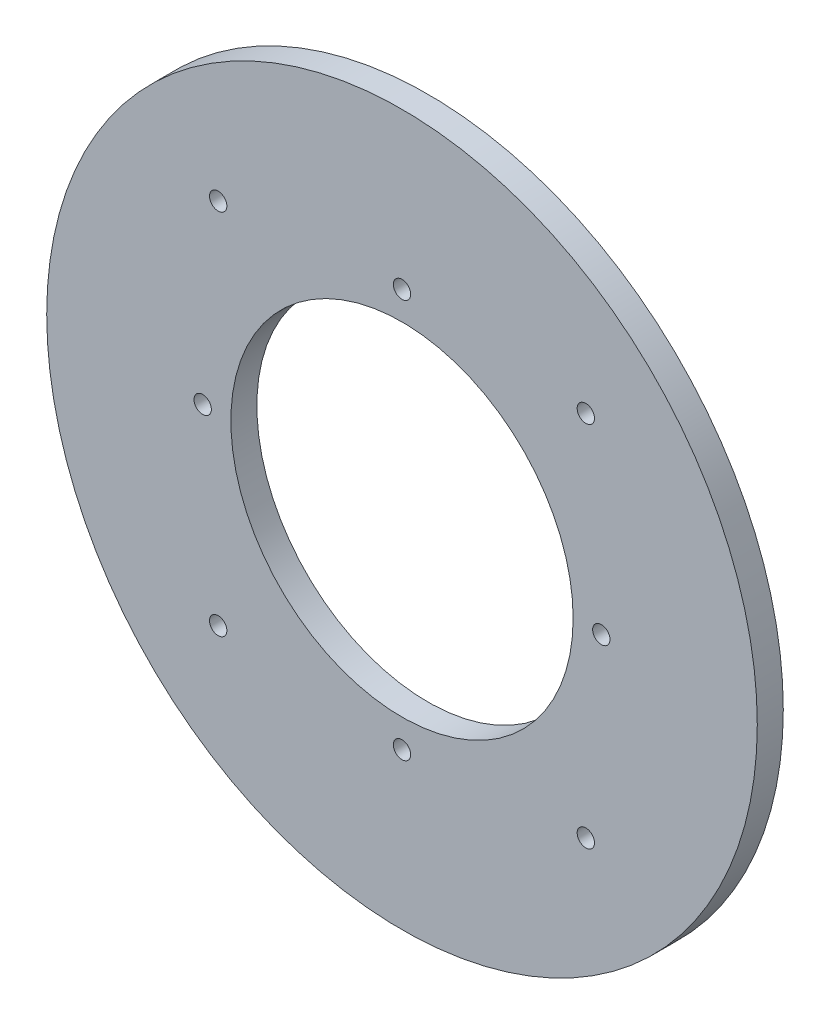
ISO-10303-21;
HEADER;
FILE_DESCRIPTION(('STEP AP214'),'2;1');
FILE_NAME('part.step','',(''),(''),'','','');
FILE_SCHEMA(('AUTOMOTIVE_DESIGN { 1 0 10303 214 1 1 1 1 }'));
ENDSEC;
DATA;
#1=APPLICATION_CONTEXT('core data for automotive mechanical design processes');
#2=APPLICATION_PROTOCOL_DEFINITION('international standard','automotive_design',2000,#1);
#3=PRODUCT_CONTEXT('',#1,'mechanical');
#4=PRODUCT('Part','Part','',(#3));
#5=PRODUCT_RELATED_PRODUCT_CATEGORY('part','',(#4));
#6=PRODUCT_DEFINITION_FORMATION('','',#4);
#7=PRODUCT_DEFINITION_CONTEXT('part definition',#1,'design');
#8=PRODUCT_DEFINITION('design','',#6,#7);
#9=PRODUCT_DEFINITION_SHAPE('','',#8);
#10=(LENGTH_UNIT() NAMED_UNIT(*) SI_UNIT(.MILLI.,.METRE.));
#11=(NAMED_UNIT(*) PLANE_ANGLE_UNIT() SI_UNIT($,.RADIAN.));
#12=(NAMED_UNIT(*) SI_UNIT($,.STERADIAN.) SOLID_ANGLE_UNIT());
#13=UNCERTAINTY_MEASURE_WITH_UNIT(LENGTH_MEASURE(1.E-05),#10,'distance_accuracy_value','');
#14=(GEOMETRIC_REPRESENTATION_CONTEXT(3) GLOBAL_UNCERTAINTY_ASSIGNED_CONTEXT((#13)) GLOBAL_UNIT_ASSIGNED_CONTEXT((#10,
#11,#12)) REPRESENTATION_CONTEXT('',''));
#15=CARTESIAN_POINT('',(0.,0.,0.));
#16=DIRECTION('',(0.,0.,1.));
#17=DIRECTION('',(1.,0.,0.));
#18=AXIS2_PLACEMENT_3D('',#15,#16,#17);
#19=CARTESIAN_POINT('',(0.,0.,6.));
#20=DIRECTION('',(0.,0.,1.));
#21=DIRECTION('',(1.,0.,0.));
#22=AXIS2_PLACEMENT_3D('',#19,#20,#21);
#23=PLANE('',#22);
#24=CARTESIAN_POINT('',(0.,46.,6.));
#25=DIRECTION('',(0.,0.,1.));
#26=DIRECTION('',(1.,0.,0.));
#27=AXIS2_PLACEMENT_3D('',#24,#25,#26);
#28=CIRCLE('',#27,2.);
#29=CARTESIAN_POINT('',(2.,46.,6.));
#30=VERTEX_POINT('',#29);
#31=EDGE_CURVE('E72',#30,#30,#28,.T.);
#32=ORIENTED_EDGE('',*,*,#31,.F.);
#33=EDGE_LOOP('',(#32));
#34=FACE_BOUND('',#33,.T.);
#35=CARTESIAN_POINT('',(46.,-1.60608141586784E-13,6.));
#36=DIRECTION('',(0.,0.,1.));
#37=DIRECTION('',(1.,0.,0.));
#38=AXIS2_PLACEMENT_3D('',#35,#36,#37);
#39=CIRCLE('',#38,2.);
#40=CARTESIAN_POINT('',(48.,-1.60608141586784E-13,6.));
#41=VERTEX_POINT('',#40);
#42=EDGE_CURVE('E124',#41,#41,#39,.T.);
#43=ORIENTED_EDGE('',*,*,#42,.F.);
#44=EDGE_LOOP('',(#43));
#45=FACE_BOUND('',#44,.T.);
#46=CARTESIAN_POINT('',(-3.21216283173568E-13,-46.,6.));
#47=DIRECTION('',(0.,0.,1.));
#48=DIRECTION('',(1.,0.,0.));
#49=AXIS2_PLACEMENT_3D('',#46,#47,#48);
#50=CIRCLE('',#49,2.);
#51=CARTESIAN_POINT('',(1.99999999999968,-46.,6.));
#52=VERTEX_POINT('',#51);
#53=EDGE_CURVE('E128',#52,#52,#50,.T.);
#54=ORIENTED_EDGE('',*,*,#53,.F.);
#55=EDGE_LOOP('',(#54));
#56=FACE_BOUND('',#55,.T.);
#57=CARTESIAN_POINT('',(-46.,4.81824424760352E-13,6.));
#58=DIRECTION('',(0.,0.,1.));
#59=DIRECTION('',(1.,0.,0.));
#60=AXIS2_PLACEMENT_3D('',#57,#58,#59);
#61=CIRCLE('',#60,2.);
#62=CARTESIAN_POINT('',(-44.,4.81824424760352E-13,6.));
#63=VERTEX_POINT('',#62);
#64=EDGE_CURVE('E132',#63,#63,#61,.T.);
#65=ORIENTED_EDGE('',*,*,#64,.F.);
#66=EDGE_LOOP('',(#65));
#67=FACE_BOUND('',#66,.T.);
#68=CARTESIAN_POINT('',(-42.426406871193,42.4264068711927,6.));
#69=DIRECTION('',(0.,0.,1.));
#70=DIRECTION('',(0.,1.,0.));
#71=AXIS2_PLACEMENT_3D('',#68,#69,#70);
#72=CIRCLE('',#71,2.);
#73=CARTESIAN_POINT('',(-42.426406871193,44.4264068711927,6.));
#74=VERTEX_POINT('',#73);
#75=EDGE_CURVE('E62',#74,#74,#72,.T.);
#76=ORIENTED_EDGE('',*,*,#75,.F.);
#77=EDGE_LOOP('',(#76));
#78=FACE_BOUND('',#77,.T.);
#79=CARTESIAN_POINT('',(-42.4264068711928,-42.4264068711928,6.));
#80=DIRECTION('',(0.,0.,1.));
#81=DIRECTION('',(-1.,0.,0.));
#82=AXIS2_PLACEMENT_3D('',#79,#80,#81);
#83=CIRCLE('',#82,2.);
#84=CARTESIAN_POINT('',(-44.4264068711928,-42.4264068711928,6.));
#85=VERTEX_POINT('',#84);
#86=EDGE_CURVE('E83',#85,#85,#83,.T.);
#87=ORIENTED_EDGE('',*,*,#86,.F.);
#88=EDGE_LOOP('',(#87));
#89=FACE_BOUND('',#88,.T.);
#90=CARTESIAN_POINT('',(42.4264068711933,-42.4264068711924,6.));
#91=DIRECTION('',(0.,0.,1.));
#92=DIRECTION('',(0.,-1.,0.));
#93=AXIS2_PLACEMENT_3D('',#90,#91,#92);
#94=CIRCLE('',#93,2.);
#95=CARTESIAN_POINT('',(42.4264068711933,-44.4264068711924,6.));
#96=VERTEX_POINT('',#95);
#97=EDGE_CURVE('E79',#96,#96,#94,.T.);
#98=ORIENTED_EDGE('',*,*,#97,.F.);
#99=EDGE_LOOP('',(#98));
#100=FACE_BOUND('',#99,.T.);
#101=CARTESIAN_POINT('',(42.4264068711928,42.4264068711928,6.));
#102=DIRECTION('',(0.,0.,1.));
#103=DIRECTION('',(1.,0.,0.));
#104=AXIS2_PLACEMENT_3D('',#101,#102,#103);
#105=CIRCLE('',#104,2.);
#106=CARTESIAN_POINT('',(44.4264068711928,42.4264068711928,6.));
#107=VERTEX_POINT('',#106);
#108=EDGE_CURVE('E57',#107,#107,#105,.T.);
#109=ORIENTED_EDGE('',*,*,#108,.F.);
#110=EDGE_LOOP('',(#109));
#111=FACE_BOUND('',#110,.T.);
#112=CARTESIAN_POINT('',(0.,0.,6.));
#113=DIRECTION('',(0.,0.,1.));
#114=DIRECTION('',(1.,0.,0.));
#115=AXIS2_PLACEMENT_3D('',#112,#113,#114);
#116=CIRCLE('',#115,82.);
#117=CARTESIAN_POINT('',(82.,0.,6.));
#118=VERTEX_POINT('',#117);
#119=EDGE_CURVE('E10',#118,#118,#116,.T.);
#120=ORIENTED_EDGE('',*,*,#119,.T.);
#121=EDGE_LOOP('',(#120));
#122=FACE_BOUND('',#121,.T.);
#123=CARTESIAN_POINT('',(0.,0.,6.));
#124=DIRECTION('',(0.,0.,1.));
#125=DIRECTION('',(1.,0.,0.));
#126=AXIS2_PLACEMENT_3D('',#123,#124,#125);
#127=CIRCLE('',#126,39.5);
#128=CARTESIAN_POINT('',(39.5,0.,6.));
#129=VERTEX_POINT('',#128);
#130=EDGE_CURVE('E48',#129,#129,#127,.T.);
#131=ORIENTED_EDGE('',*,*,#130,.F.);
#132=EDGE_LOOP('',(#131));
#133=FACE_BOUND('',#132,.T.);
#134=ADVANCED_FACE('F35',(#34,#45,#56,#67,#78,#89,#100,#111,#122,#133),#23,.T.);
#135=CARTESIAN_POINT('',(0.,0.,0.));
#136=DIRECTION('',(0.,0.,1.));
#137=DIRECTION('',(1.,0.,0.));
#138=AXIS2_PLACEMENT_3D('',#135,#136,#137);
#139=PLANE('',#138);
#140=CARTESIAN_POINT('',(0.,46.,0.));
#141=DIRECTION('',(0.,0.,1.));
#142=DIRECTION('',(1.,0.,0.));
#143=AXIS2_PLACEMENT_3D('',#140,#141,#142);
#144=CIRCLE('',#143,2.);
#145=CARTESIAN_POINT('',(2.,46.,0.));
#146=VERTEX_POINT('',#145);
#147=EDGE_CURVE('E39',#146,#146,#144,.T.);
#148=ORIENTED_EDGE('',*,*,#147,.T.);
#149=EDGE_LOOP('',(#148));
#150=FACE_BOUND('',#149,.T.);
#151=CARTESIAN_POINT('',(46.,-1.60608141586784E-13,0.));
#152=DIRECTION('',(0.,0.,1.));
#153=DIRECTION('',(1.,0.,0.));
#154=AXIS2_PLACEMENT_3D('',#151,#152,#153);
#155=CIRCLE('',#154,2.);
#156=CARTESIAN_POINT('',(48.,-1.60608141586784E-13,0.));
#157=VERTEX_POINT('',#156);
#158=EDGE_CURVE('E74',#157,#157,#155,.T.);
#159=ORIENTED_EDGE('',*,*,#158,.T.);
#160=EDGE_LOOP('',(#159));
#161=FACE_BOUND('',#160,.T.);
#162=CARTESIAN_POINT('',(-3.21216283173568E-13,-46.,0.));
#163=DIRECTION('',(0.,0.,1.));
#164=DIRECTION('',(1.,0.,0.));
#165=AXIS2_PLACEMENT_3D('',#162,#163,#164);
#166=CIRCLE('',#165,2.);
#167=CARTESIAN_POINT('',(1.99999999999968,-46.,0.));
#168=VERTEX_POINT('',#167);
#169=EDGE_CURVE('E71',#168,#168,#166,.T.);
#170=ORIENTED_EDGE('',*,*,#169,.T.);
#171=EDGE_LOOP('',(#170));
#172=FACE_BOUND('',#171,.T.);
#173=CARTESIAN_POINT('',(-46.,4.81824424760352E-13,0.));
#174=DIRECTION('',(0.,0.,1.));
#175=DIRECTION('',(1.,0.,0.));
#176=AXIS2_PLACEMENT_3D('',#173,#174,#175);
#177=CIRCLE('',#176,2.);
#178=CARTESIAN_POINT('',(-44.,4.81824424760352E-13,0.));
#179=VERTEX_POINT('',#178);
#180=EDGE_CURVE('E68',#179,#179,#177,.T.);
#181=ORIENTED_EDGE('',*,*,#180,.T.);
#182=EDGE_LOOP('',(#181));
#183=FACE_BOUND('',#182,.T.);
#184=CARTESIAN_POINT('',(-42.426406871193,42.4264068711927,0.));
#185=DIRECTION('',(0.,0.,1.));
#186=DIRECTION('',(1.,0.,0.));
#187=AXIS2_PLACEMENT_3D('',#184,#185,#186);
#188=CIRCLE('',#187,2.);
#189=CARTESIAN_POINT('',(-40.426406871193,42.4264068711927,0.));
#190=VERTEX_POINT('',#189);
#191=EDGE_CURVE('E65',#190,#190,#188,.T.);
#192=ORIENTED_EDGE('',*,*,#191,.T.);
#193=EDGE_LOOP('',(#192));
#194=FACE_BOUND('',#193,.T.);
#195=CARTESIAN_POINT('',(-42.4264068711928,-42.4264068711928,0.));
#196=DIRECTION('',(0.,0.,1.));
#197=DIRECTION('',(1.,0.,0.));
#198=AXIS2_PLACEMENT_3D('',#195,#196,#197);
#199=CIRCLE('',#198,2.);
#200=CARTESIAN_POINT('',(-40.4264068711928,-42.4264068711928,0.));
#201=VERTEX_POINT('',#200);
#202=EDGE_CURVE('E61',#201,#201,#199,.T.);
#203=ORIENTED_EDGE('',*,*,#202,.T.);
#204=EDGE_LOOP('',(#203));
#205=FACE_BOUND('',#204,.T.);
#206=CARTESIAN_POINT('',(42.4264068711933,-42.4264068711924,0.));
#207=DIRECTION('',(0.,0.,1.));
#208=DIRECTION('',(1.,0.,0.));
#209=AXIS2_PLACEMENT_3D('',#206,#207,#208);
#210=CIRCLE('',#209,2.);
#211=CARTESIAN_POINT('',(44.4264068711933,-42.4264068711924,0.));
#212=VERTEX_POINT('',#211);
#213=EDGE_CURVE('E58',#212,#212,#210,.T.);
#214=ORIENTED_EDGE('',*,*,#213,.T.);
#215=EDGE_LOOP('',(#214));
#216=FACE_BOUND('',#215,.T.);
#217=CARTESIAN_POINT('',(42.4264068711928,42.4264068711928,0.));
#218=DIRECTION('',(0.,0.,1.));
#219=DIRECTION('',(1.,0.,0.));
#220=AXIS2_PLACEMENT_3D('',#217,#218,#219);
#221=CIRCLE('',#220,2.);
#222=CARTESIAN_POINT('',(44.4264068711928,42.4264068711928,0.));
#223=VERTEX_POINT('',#222);
#224=EDGE_CURVE('E54',#223,#223,#221,.T.);
#225=ORIENTED_EDGE('',*,*,#224,.T.);
#226=EDGE_LOOP('',(#225));
#227=FACE_BOUND('',#226,.T.);
#228=CARTESIAN_POINT('',(0.,0.,0.));
#229=DIRECTION('',(0.,0.,1.));
#230=DIRECTION('',(1.,0.,0.));
#231=AXIS2_PLACEMENT_3D('',#228,#229,#230);
#232=CIRCLE('',#231,82.);
#233=CARTESIAN_POINT('',(82.,0.,0.));
#234=VERTEX_POINT('',#233);
#235=EDGE_CURVE('E43',#234,#234,#232,.T.);
#236=ORIENTED_EDGE('',*,*,#235,.F.);
#237=EDGE_LOOP('',(#236));
#238=FACE_BOUND('',#237,.T.);
#239=CARTESIAN_POINT('',(0.,0.,0.));
#240=DIRECTION('',(0.,0.,1.));
#241=DIRECTION('',(1.,0.,0.));
#242=AXIS2_PLACEMENT_3D('',#239,#240,#241);
#243=CIRCLE('',#242,39.5);
#244=CARTESIAN_POINT('',(39.5,0.,0.));
#245=VERTEX_POINT('',#244);
#246=EDGE_CURVE('E51',#245,#245,#243,.T.);
#247=ORIENTED_EDGE('',*,*,#246,.T.);
#248=EDGE_LOOP('',(#247));
#249=FACE_BOUND('',#248,.T.);
#250=ADVANCED_FACE('F98',(#150,#161,#172,#183,#194,#205,#216,#227,#238,#249),#139,.F.);
#251=CARTESIAN_POINT('',(0.,0.,6.));
#252=DIRECTION('',(0.,0.,-1.));
#253=DIRECTION('',(-1.,0.,0.));
#254=AXIS2_PLACEMENT_3D('',#251,#252,#253);
#255=CYLINDRICAL_SURFACE('',#254,82.);
#256=ORIENTED_EDGE('',*,*,#119,.F.);
#257=EDGE_LOOP('',(#256));
#258=FACE_BOUND('',#257,.T.);
#259=ORIENTED_EDGE('',*,*,#235,.T.);
#260=EDGE_LOOP('',(#259));
#261=FACE_BOUND('',#260,.T.);
#262=ADVANCED_FACE('F37',(#258,#261),#255,.T.);
#263=CARTESIAN_POINT('',(0.,0.,6.));
#264=DIRECTION('',(0.,0.,-1.));
#265=DIRECTION('',(-1.,0.,0.));
#266=AXIS2_PLACEMENT_3D('',#263,#264,#265);
#267=CYLINDRICAL_SURFACE('',#266,39.5);
#268=ORIENTED_EDGE('',*,*,#130,.T.);
#269=EDGE_LOOP('',(#268));
#270=FACE_BOUND('',#269,.T.);
#271=ORIENTED_EDGE('',*,*,#246,.F.);
#272=EDGE_LOOP('',(#271));
#273=FACE_BOUND('',#272,.T.);
#274=ADVANCED_FACE('F100',(#270,#273),#267,.F.);
#275=CARTESIAN_POINT('',(42.4264068711928,42.4264068711928,-4.));
#276=DIRECTION('',(0.,0.,1.));
#277=DIRECTION('',(1.,0.,0.));
#278=AXIS2_PLACEMENT_3D('',#275,#276,#277);
#279=CYLINDRICAL_SURFACE('',#278,2.);
#280=ORIENTED_EDGE('',*,*,#108,.T.);
#281=EDGE_LOOP('',(#280));
#282=FACE_BOUND('',#281,.T.);
#283=ORIENTED_EDGE('',*,*,#224,.F.);
#284=EDGE_LOOP('',(#283));
#285=FACE_BOUND('',#284,.T.);
#286=ADVANCED_FACE('F102',(#282,#285),#279,.F.);
#287=CARTESIAN_POINT('',(42.4264068711933,-42.4264068711924,-4.));
#288=DIRECTION('',(0.,0.,1.));
#289=DIRECTION('',(1.,0.,0.));
#290=AXIS2_PLACEMENT_3D('',#287,#288,#289);
#291=CYLINDRICAL_SURFACE('',#290,2.);
#292=ORIENTED_EDGE('',*,*,#97,.T.);
#293=EDGE_LOOP('',(#292));
#294=FACE_BOUND('',#293,.T.);
#295=ORIENTED_EDGE('',*,*,#213,.F.);
#296=EDGE_LOOP('',(#295));
#297=FACE_BOUND('',#296,.T.);
#298=ADVANCED_FACE('F108',(#294,#297),#291,.F.);
#299=CARTESIAN_POINT('',(-42.4264068711928,-42.4264068711928,-4.));
#300=DIRECTION('',(0.,0.,1.));
#301=DIRECTION('',(1.,0.,0.));
#302=AXIS2_PLACEMENT_3D('',#299,#300,#301);
#303=CYLINDRICAL_SURFACE('',#302,2.);
#304=ORIENTED_EDGE('',*,*,#86,.T.);
#305=EDGE_LOOP('',(#304));
#306=FACE_BOUND('',#305,.T.);
#307=ORIENTED_EDGE('',*,*,#202,.F.);
#308=EDGE_LOOP('',(#307));
#309=FACE_BOUND('',#308,.T.);
#310=ADVANCED_FACE('F148',(#306,#309),#303,.F.);
#311=CARTESIAN_POINT('',(-42.426406871193,42.4264068711927,-4.));
#312=DIRECTION('',(0.,0.,1.));
#313=DIRECTION('',(1.,0.,0.));
#314=AXIS2_PLACEMENT_3D('',#311,#312,#313);
#315=CYLINDRICAL_SURFACE('',#314,2.);
#316=ORIENTED_EDGE('',*,*,#75,.T.);
#317=EDGE_LOOP('',(#316));
#318=FACE_BOUND('',#317,.T.);
#319=ORIENTED_EDGE('',*,*,#191,.F.);
#320=EDGE_LOOP('',(#319));
#321=FACE_BOUND('',#320,.T.);
#322=ADVANCED_FACE('F151',(#318,#321),#315,.F.);
#323=CARTESIAN_POINT('',(-46.,4.81824424760352E-13,-4.));
#324=DIRECTION('',(0.,0.,1.));
#325=DIRECTION('',(1.,0.,0.));
#326=AXIS2_PLACEMENT_3D('',#323,#324,#325);
#327=CYLINDRICAL_SURFACE('',#326,2.);
#328=ORIENTED_EDGE('',*,*,#64,.T.);
#329=EDGE_LOOP('',(#328));
#330=FACE_BOUND('',#329,.T.);
#331=ORIENTED_EDGE('',*,*,#180,.F.);
#332=EDGE_LOOP('',(#331));
#333=FACE_BOUND('',#332,.T.);
#334=ADVANCED_FACE('F165',(#330,#333),#327,.F.);
#335=CARTESIAN_POINT('',(-3.21216283173568E-13,-46.,-4.));
#336=DIRECTION('',(0.,0.,1.));
#337=DIRECTION('',(1.,0.,0.));
#338=AXIS2_PLACEMENT_3D('',#335,#336,#337);
#339=CYLINDRICAL_SURFACE('',#338,2.);
#340=ORIENTED_EDGE('',*,*,#53,.T.);
#341=EDGE_LOOP('',(#340));
#342=FACE_BOUND('',#341,.T.);
#343=ORIENTED_EDGE('',*,*,#169,.F.);
#344=EDGE_LOOP('',(#343));
#345=FACE_BOUND('',#344,.T.);
#346=ADVANCED_FACE('F169',(#342,#345),#339,.F.);
#347=CARTESIAN_POINT('',(46.,-1.60608141586784E-13,-4.));
#348=DIRECTION('',(0.,0.,1.));
#349=DIRECTION('',(1.,0.,0.));
#350=AXIS2_PLACEMENT_3D('',#347,#348,#349);
#351=CYLINDRICAL_SURFACE('',#350,2.);
#352=ORIENTED_EDGE('',*,*,#42,.T.);
#353=EDGE_LOOP('',(#352));
#354=FACE_BOUND('',#353,.T.);
#355=ORIENTED_EDGE('',*,*,#158,.F.);
#356=EDGE_LOOP('',(#355));
#357=FACE_BOUND('',#356,.T.);
#358=ADVANCED_FACE('F173',(#354,#357),#351,.F.);
#359=CARTESIAN_POINT('',(0.,46.,-4.));
#360=DIRECTION('',(0.,0.,1.));
#361=DIRECTION('',(1.,0.,0.));
#362=AXIS2_PLACEMENT_3D('',#359,#360,#361);
#363=CYLINDRICAL_SURFACE('',#362,2.);
#364=ORIENTED_EDGE('',*,*,#31,.T.);
#365=EDGE_LOOP('',(#364));
#366=FACE_BOUND('',#365,.T.);
#367=ORIENTED_EDGE('',*,*,#147,.F.);
#368=EDGE_LOOP('',(#367));
#369=FACE_BOUND('',#368,.T.);
#370=ADVANCED_FACE('F177',(#366,#369),#363,.F.);
#371=CLOSED_SHELL('',(#134,#250,#262,#274,#286,#298,#310,#322,#334,#346,#358,#370));
#372=MANIFOLD_SOLID_BREP('B2',#371);
#373=ADVANCED_BREP_SHAPE_REPRESENTATION('',(#18,#372),#14);
#374=SHAPE_DEFINITION_REPRESENTATION(#9,#373);
ENDSEC;
END-ISO-10303-21;
